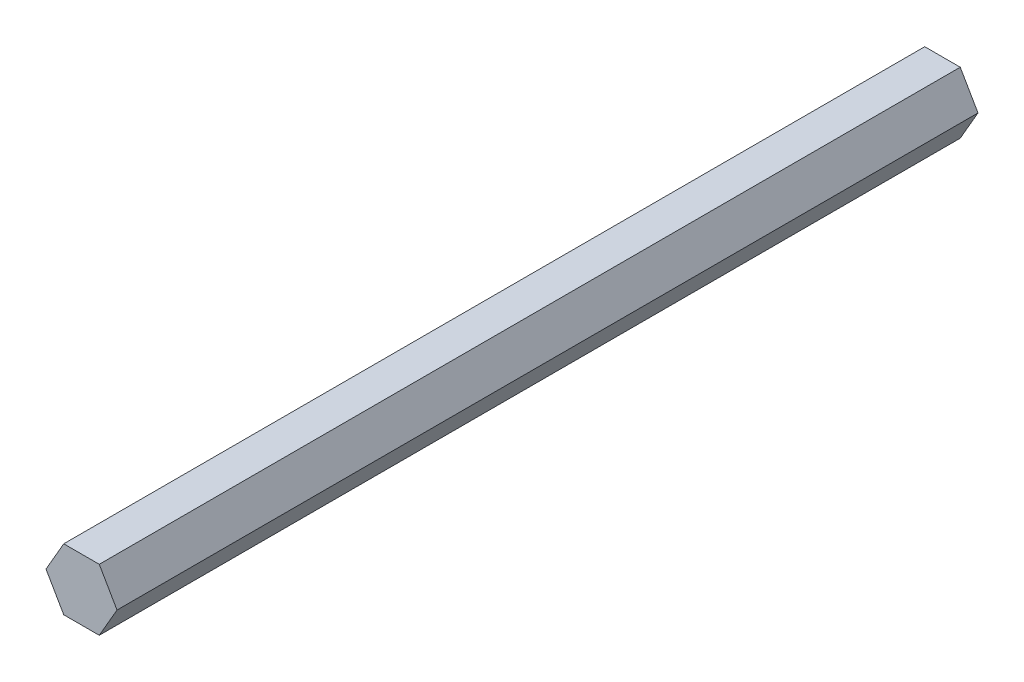
ISO-10303-21;
HEADER;
FILE_DESCRIPTION(('STEP AP214'),'2;1');
FILE_NAME('part.step','',(''),(''),'','','');
FILE_SCHEMA(('AUTOMOTIVE_DESIGN { 1 0 10303 214 1 1 1 1 }'));
ENDSEC;
DATA;
#1=APPLICATION_CONTEXT('core data for automotive mechanical design processes');
#2=APPLICATION_PROTOCOL_DEFINITION('international standard','automotive_design',2000,#1);
#3=PRODUCT_CONTEXT('',#1,'mechanical');
#4=PRODUCT('Part','Part','',(#3));
#5=PRODUCT_RELATED_PRODUCT_CATEGORY('part','',(#4));
#6=PRODUCT_DEFINITION_FORMATION('','',#4);
#7=PRODUCT_DEFINITION_CONTEXT('part definition',#1,'design');
#8=PRODUCT_DEFINITION('design','',#6,#7);
#9=PRODUCT_DEFINITION_SHAPE('','',#8);
#10=(LENGTH_UNIT() NAMED_UNIT(*) SI_UNIT(.MILLI.,.METRE.));
#11=(NAMED_UNIT(*) PLANE_ANGLE_UNIT() SI_UNIT($,.RADIAN.));
#12=(NAMED_UNIT(*) SI_UNIT($,.STERADIAN.) SOLID_ANGLE_UNIT());
#13=UNCERTAINTY_MEASURE_WITH_UNIT(LENGTH_MEASURE(1.E-05),#10,'distance_accuracy_value','');
#14=(GEOMETRIC_REPRESENTATION_CONTEXT(3) GLOBAL_UNCERTAINTY_ASSIGNED_CONTEXT((#13)) GLOBAL_UNIT_ASSIGNED_CONTEXT((#10,
#11,#12)) REPRESENTATION_CONTEXT('',''));
#15=CARTESIAN_POINT('',(0.,0.,0.));
#16=DIRECTION('',(0.,0.,1.));
#17=DIRECTION('',(1.,0.,0.));
#18=AXIS2_PLACEMENT_3D('',#15,#16,#17);
#19=CARTESIAN_POINT('',(-3.66617420935412,6.35,177.8));
#20=DIRECTION('',(0.866025403784438,-0.500000000000001,0.));
#21=DIRECTION('',(0.500000000000001,0.866025403784438,0.));
#22=AXIS2_PLACEMENT_3D('',#19,#20,#21);
#23=PLANE('',#22);
#24=DIRECTION('',(-0.500000000000001,-0.866025403784438,0.));
#25=VECTOR('',#24,1.);
#26=CARTESIAN_POINT('',(-3.66617420935412,6.35,0.));
#27=LINE('',#26,#25);
#28=CARTESIAN_POINT('',(0.,12.7,0.));
#29=VERTEX_POINT('',#28);
#30=CARTESIAN_POINT('',(-3.66617420935412,6.35,0.));
#31=VERTEX_POINT('',#30);
#32=EDGE_CURVE('E128',#29,#31,#27,.T.);
#33=ORIENTED_EDGE('',*,*,#32,.T.);
#34=DIRECTION('',(0.,0.,-1.));
#35=VECTOR('',#34,1.);
#36=CARTESIAN_POINT('',(-3.66617420935412,6.35,177.8));
#37=LINE('',#36,#35);
#38=CARTESIAN_POINT('',(-3.66617420935412,6.35,177.8));
#39=VERTEX_POINT('',#38);
#40=EDGE_CURVE('E11',#39,#31,#37,.T.);
#41=ORIENTED_EDGE('',*,*,#40,.F.);
#42=DIRECTION('',(-0.500000000000001,-0.866025403784438,0.));
#43=VECTOR('',#42,1.);
#44=CARTESIAN_POINT('',(-3.66617420935412,6.35,177.8));
#45=LINE('',#44,#43);
#46=CARTESIAN_POINT('',(0.,12.7,177.8));
#47=VERTEX_POINT('',#46);
#48=EDGE_CURVE('E144',#47,#39,#45,.T.);
#49=ORIENTED_EDGE('',*,*,#48,.F.);
#50=DIRECTION('',(0.,0.,-1.));
#51=VECTOR('',#50,1.);
#52=CARTESIAN_POINT('',(0.,12.7,177.8));
#53=LINE('',#52,#51);
#54=EDGE_CURVE('E124',#47,#29,#53,.T.);
#55=ORIENTED_EDGE('',*,*,#54,.T.);
#56=EDGE_LOOP('',(#33,#41,#49,#55));
#57=FACE_BOUND('',#56,.T.);
#58=ADVANCED_FACE('F39',(#57),#23,.F.);
#59=CARTESIAN_POINT('',(0.,0.,177.8));
#60=DIRECTION('',(0.866025403784439,0.499999999999999,0.));
#61=DIRECTION('',(-0.5,0.866025403784439,0.));
#62=AXIS2_PLACEMENT_3D('',#59,#60,#61);
#63=PLANE('',#62);
#64=DIRECTION('',(0.499999999999999,-0.866025403784439,0.));
#65=VECTOR('',#64,1.);
#66=CARTESIAN_POINT('',(0.,0.,0.));
#67=LINE('',#66,#65);
#68=CARTESIAN_POINT('',(0.,0.,0.));
#69=VERTEX_POINT('',#68);
#70=EDGE_CURVE('E132',#31,#69,#67,.T.);
#71=ORIENTED_EDGE('',*,*,#70,.T.);
#72=DIRECTION('',(0.,0.,-1.));
#73=VECTOR('',#72,1.);
#74=CARTESIAN_POINT('',(0.,0.,177.8));
#75=LINE('',#74,#73);
#76=CARTESIAN_POINT('',(0.,0.,177.8));
#77=VERTEX_POINT('',#76);
#78=EDGE_CURVE('E48',#77,#69,#75,.T.);
#79=ORIENTED_EDGE('',*,*,#78,.F.);
#80=DIRECTION('',(0.499999999999999,-0.866025403784439,0.));
#81=VECTOR('',#80,1.);
#82=CARTESIAN_POINT('',(0.,0.,177.8));
#83=LINE('',#82,#81);
#84=EDGE_CURVE('E93',#39,#77,#83,.T.);
#85=ORIENTED_EDGE('',*,*,#84,.F.);
#86=ORIENTED_EDGE('',*,*,#40,.T.);
#87=EDGE_LOOP('',(#71,#79,#85,#86));
#88=FACE_BOUND('',#87,.T.);
#89=ADVANCED_FACE('F172',(#88),#63,.F.);
#90=CARTESIAN_POINT('',(7.33234841870825,0.,177.8));
#91=DIRECTION('',(0.,1.,0.));
#92=DIRECTION('',(0.,0.,1.));
#93=AXIS2_PLACEMENT_3D('',#90,#91,#92);
#94=PLANE('',#93);
#95=DIRECTION('',(1.,0.,0.));
#96=VECTOR('',#95,1.);
#97=CARTESIAN_POINT('',(7.33234841870825,0.,0.));
#98=LINE('',#97,#96);
#99=CARTESIAN_POINT('',(7.33234841870825,0.,0.));
#100=VERTEX_POINT('',#99);
#101=EDGE_CURVE('E135',#69,#100,#98,.T.);
#102=ORIENTED_EDGE('',*,*,#101,.T.);
#103=DIRECTION('',(0.,0.,-1.));
#104=VECTOR('',#103,1.);
#105=CARTESIAN_POINT('',(7.33234841870825,0.,177.8));
#106=LINE('',#105,#104);
#107=CARTESIAN_POINT('',(7.33234841870825,0.,177.8));
#108=VERTEX_POINT('',#107);
#109=EDGE_CURVE('E117',#108,#100,#106,.T.);
#110=ORIENTED_EDGE('',*,*,#109,.F.);
#111=DIRECTION('',(1.,0.,0.));
#112=VECTOR('',#111,1.);
#113=CARTESIAN_POINT('',(7.33234841870825,0.,177.8));
#114=LINE('',#113,#112);
#115=EDGE_CURVE('E106',#77,#108,#114,.T.);
#116=ORIENTED_EDGE('',*,*,#115,.F.);
#117=ORIENTED_EDGE('',*,*,#78,.T.);
#118=EDGE_LOOP('',(#102,#110,#116,#117));
#119=FACE_BOUND('',#118,.T.);
#120=ADVANCED_FACE('F154',(#119),#94,.F.);
#121=CARTESIAN_POINT('',(10.9985226280624,6.34999999999999,177.8));
#122=DIRECTION('',(-0.866025403784438,0.500000000000001,0.));
#123=DIRECTION('',(-0.500000000000001,-0.866025403784438,0.));
#124=AXIS2_PLACEMENT_3D('',#121,#122,#123);
#125=PLANE('',#124);
#126=DIRECTION('',(0.5,0.866025403784438,0.));
#127=VECTOR('',#126,1.);
#128=CARTESIAN_POINT('',(10.9985226280624,6.34999999999999,0.));
#129=LINE('',#128,#127);
#130=CARTESIAN_POINT('',(10.9985226280624,6.34999999999999,0.));
#131=VERTEX_POINT('',#130);
#132=EDGE_CURVE('E115',#100,#131,#129,.T.);
#133=ORIENTED_EDGE('',*,*,#132,.T.);
#134=DIRECTION('',(0.,0.,-1.));
#135=VECTOR('',#134,1.);
#136=CARTESIAN_POINT('',(10.9985226280624,6.34999999999999,177.8));
#137=LINE('',#136,#135);
#138=CARTESIAN_POINT('',(10.9985226280624,6.34999999999999,177.8));
#139=VERTEX_POINT('',#138);
#140=EDGE_CURVE('E112',#139,#131,#137,.T.);
#141=ORIENTED_EDGE('',*,*,#140,.F.);
#142=DIRECTION('',(0.5,0.866025403784438,0.));
#143=VECTOR('',#142,1.);
#144=CARTESIAN_POINT('',(10.9985226280624,6.34999999999999,177.8));
#145=LINE('',#144,#143);
#146=EDGE_CURVE('E100',#108,#139,#145,.T.);
#147=ORIENTED_EDGE('',*,*,#146,.F.);
#148=ORIENTED_EDGE('',*,*,#109,.T.);
#149=EDGE_LOOP('',(#133,#141,#147,#148));
#150=FACE_BOUND('',#149,.T.);
#151=ADVANCED_FACE('F113',(#150),#125,.F.);
#152=CARTESIAN_POINT('',(7.33234841870826,12.7,177.8));
#153=DIRECTION('',(-0.866025403784439,-0.499999999999999,0.));
#154=DIRECTION('',(0.499999999999999,-0.866025403784439,0.));
#155=AXIS2_PLACEMENT_3D('',#152,#153,#154);
#156=PLANE('',#155);
#157=DIRECTION('',(-0.499999999999999,0.866025403784439,0.));
#158=VECTOR('',#157,1.);
#159=CARTESIAN_POINT('',(7.33234841870826,12.7,0.));
#160=LINE('',#159,#158);
#161=CARTESIAN_POINT('',(7.33234841870826,12.7,0.));
#162=VERTEX_POINT('',#161);
#163=EDGE_CURVE('E79',#131,#162,#160,.T.);
#164=ORIENTED_EDGE('',*,*,#163,.T.);
#165=DIRECTION('',(0.,0.,-1.));
#166=VECTOR('',#165,1.);
#167=CARTESIAN_POINT('',(7.33234841870826,12.7,177.8));
#168=LINE('',#167,#166);
#169=CARTESIAN_POINT('',(7.33234841870826,12.7,177.8));
#170=VERTEX_POINT('',#169);
#171=EDGE_CURVE('E118',#170,#162,#168,.T.);
#172=ORIENTED_EDGE('',*,*,#171,.F.);
#173=DIRECTION('',(-0.499999999999999,0.866025403784439,0.));
#174=VECTOR('',#173,1.);
#175=CARTESIAN_POINT('',(7.33234841870826,12.7,177.8));
#176=LINE('',#175,#174);
#177=EDGE_CURVE('E104',#139,#170,#176,.T.);
#178=ORIENTED_EDGE('',*,*,#177,.F.);
#179=ORIENTED_EDGE('',*,*,#140,.T.);
#180=EDGE_LOOP('',(#164,#172,#178,#179));
#181=FACE_BOUND('',#180,.T.);
#182=ADVANCED_FACE('F120',(#181),#156,.F.);
#183=CARTESIAN_POINT('',(0.,12.7,177.8));
#184=DIRECTION('',(0.,-1.,0.));
#185=DIRECTION('',(1.,0.,0.));
#186=AXIS2_PLACEMENT_3D('',#183,#184,#185);
#187=PLANE('',#186);
#188=DIRECTION('',(-1.,0.,0.));
#189=VECTOR('',#188,1.);
#190=CARTESIAN_POINT('',(0.,12.7,0.));
#191=LINE('',#190,#189);
#192=EDGE_CURVE('E85',#162,#29,#191,.T.);
#193=ORIENTED_EDGE('',*,*,#192,.T.);
#194=ORIENTED_EDGE('',*,*,#54,.F.);
#195=DIRECTION('',(-1.,0.,0.));
#196=VECTOR('',#195,1.);
#197=CARTESIAN_POINT('',(0.,12.7,177.8));
#198=LINE('',#197,#196);
#199=EDGE_CURVE('E56',#170,#47,#198,.T.);
#200=ORIENTED_EDGE('',*,*,#199,.F.);
#201=ORIENTED_EDGE('',*,*,#171,.T.);
#202=EDGE_LOOP('',(#193,#194,#200,#201));
#203=FACE_BOUND('',#202,.T.);
#204=ADVANCED_FACE('F161',(#203),#187,.F.);
#205=CARTESIAN_POINT('',(0.,0.,177.8));
#206=DIRECTION('',(0.,0.,-1.));
#207=DIRECTION('',(-1.,0.,0.));
#208=AXIS2_PLACEMENT_3D('',#205,#206,#207);
#209=PLANE('',#208);
#210=ORIENTED_EDGE('',*,*,#48,.T.);
#211=ORIENTED_EDGE('',*,*,#84,.T.);
#212=ORIENTED_EDGE('',*,*,#115,.T.);
#213=ORIENTED_EDGE('',*,*,#146,.T.);
#214=ORIENTED_EDGE('',*,*,#177,.T.);
#215=ORIENTED_EDGE('',*,*,#199,.T.);
#216=EDGE_LOOP('',(#210,#211,#212,#213,#214,#215));
#217=FACE_BOUND('',#216,.T.);
#218=ADVANCED_FACE('F102',(#217),#209,.F.);
#219=CARTESIAN_POINT('',(0.,0.,0.));
#220=DIRECTION('',(0.,0.,-1.));
#221=DIRECTION('',(-1.,0.,0.));
#222=AXIS2_PLACEMENT_3D('',#219,#220,#221);
#223=PLANE('',#222);
#224=ORIENTED_EDGE('',*,*,#32,.F.);
#225=ORIENTED_EDGE('',*,*,#192,.F.);
#226=ORIENTED_EDGE('',*,*,#163,.F.);
#227=ORIENTED_EDGE('',*,*,#132,.F.);
#228=ORIENTED_EDGE('',*,*,#101,.F.);
#229=ORIENTED_EDGE('',*,*,#70,.F.);
#230=EDGE_LOOP('',(#224,#225,#226,#227,#228,#229));
#231=FACE_BOUND('',#230,.T.);
#232=ADVANCED_FACE('F157',(#231),#223,.T.);
#233=CLOSED_SHELL('',(#58,#89,#120,#151,#182,#204,#218,#232));
#234=MANIFOLD_SOLID_BREP('B2',#233);
#235=ADVANCED_BREP_SHAPE_REPRESENTATION('',(#18,#234),#14);
#236=SHAPE_DEFINITION_REPRESENTATION(#9,#235);
ENDSEC;
END-ISO-10303-21;
